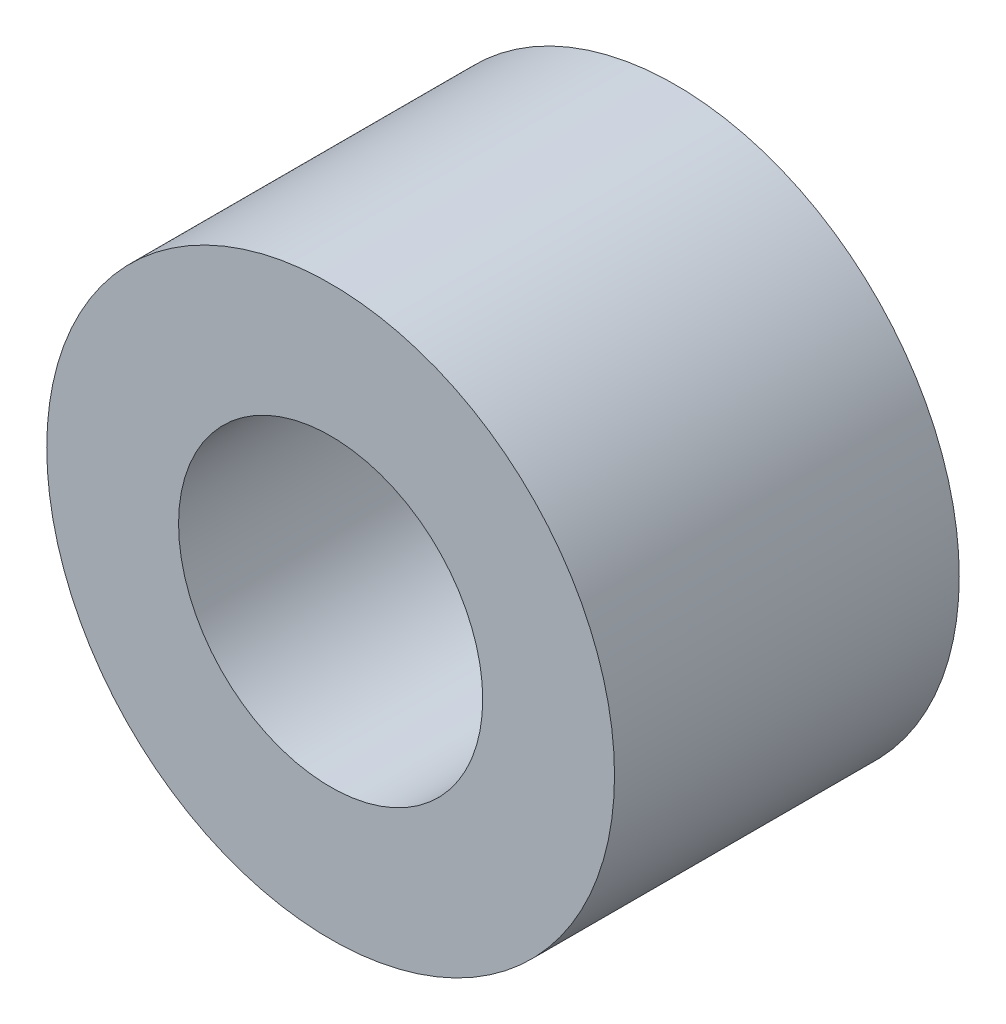
ISO-10303-21;
HEADER;
FILE_DESCRIPTION(('STEP AP214'),'2;1');
FILE_NAME('part.step','',(''),(''),'','','');
FILE_SCHEMA(('AUTOMOTIVE_DESIGN { 1 0 10303 214 1 1 1 1 }'));
ENDSEC;
DATA;
#1=APPLICATION_CONTEXT('core data for automotive mechanical design processes');
#2=APPLICATION_PROTOCOL_DEFINITION('international standard','automotive_design',2000,#1);
#3=PRODUCT_CONTEXT('',#1,'mechanical');
#4=PRODUCT('Part','Part','',(#3));
#5=PRODUCT_RELATED_PRODUCT_CATEGORY('part','',(#4));
#6=PRODUCT_DEFINITION_FORMATION('','',#4);
#7=PRODUCT_DEFINITION_CONTEXT('part definition',#1,'design');
#8=PRODUCT_DEFINITION('design','',#6,#7);
#9=PRODUCT_DEFINITION_SHAPE('','',#8);
#10=(LENGTH_UNIT() NAMED_UNIT(*) SI_UNIT(.MILLI.,.METRE.));
#11=(NAMED_UNIT(*) PLANE_ANGLE_UNIT() SI_UNIT($,.RADIAN.));
#12=(NAMED_UNIT(*) SI_UNIT($,.STERADIAN.) SOLID_ANGLE_UNIT());
#13=UNCERTAINTY_MEASURE_WITH_UNIT(LENGTH_MEASURE(1.E-05),#10,'distance_accuracy_value','');
#14=(GEOMETRIC_REPRESENTATION_CONTEXT(3) GLOBAL_UNCERTAINTY_ASSIGNED_CONTEXT((#13)) GLOBAL_UNIT_ASSIGNED_CONTEXT((#10,
#11,#12)) REPRESENTATION_CONTEXT('',''));
#15=CARTESIAN_POINT('',(0.,0.,0.));
#16=DIRECTION('',(0.,0.,1.));
#17=DIRECTION('',(1.,0.,0.));
#18=AXIS2_PLACEMENT_3D('',#15,#16,#17);
#19=CARTESIAN_POINT('',(0.,0.,-34.));
#20=DIRECTION('',(0.,0.,1.));
#21=DIRECTION('',(1.,0.,0.));
#22=AXIS2_PLACEMENT_3D('',#19,#20,#21);
#23=CYLINDRICAL_SURFACE('',#22,15.);
#24=CARTESIAN_POINT('',(0.,0.,-34.));
#25=DIRECTION('',(0.,0.,1.));
#26=DIRECTION('',(1.,0.,0.));
#27=AXIS2_PLACEMENT_3D('',#24,#25,#26);
#28=CIRCLE('',#27,15.);
#29=CARTESIAN_POINT('',(15.,0.,-34.));
#30=VERTEX_POINT('',#29);
#31=EDGE_CURVE('E43',#30,#30,#28,.T.);
#32=ORIENTED_EDGE('',*,*,#31,.F.);
#33=EDGE_LOOP('',(#32));
#34=FACE_BOUND('',#33,.T.);
#35=CARTESIAN_POINT('',(0.,0.,0.));
#36=DIRECTION('',(0.,0.,1.));
#37=DIRECTION('',(1.,0.,0.));
#38=AXIS2_PLACEMENT_3D('',#35,#36,#37);
#39=CIRCLE('',#38,15.);
#40=CARTESIAN_POINT('',(15.,0.,0.));
#41=VERTEX_POINT('',#40);
#42=EDGE_CURVE('E50',#41,#41,#39,.T.);
#43=ORIENTED_EDGE('',*,*,#42,.T.);
#44=EDGE_LOOP('',(#43));
#45=FACE_BOUND('',#44,.T.);
#46=ADVANCED_FACE('F36',(#34,#45),#23,.F.);
#47=CARTESIAN_POINT('',(0.,0.,-34.));
#48=DIRECTION('',(0.,0.,1.));
#49=DIRECTION('',(1.,0.,0.));
#50=AXIS2_PLACEMENT_3D('',#47,#48,#49);
#51=CYLINDRICAL_SURFACE('',#50,28.);
#52=CARTESIAN_POINT('',(0.,0.,-34.));
#53=DIRECTION('',(0.,0.,1.));
#54=DIRECTION('',(1.,0.,0.));
#55=AXIS2_PLACEMENT_3D('',#52,#53,#54);
#56=CIRCLE('',#55,28.);
#57=CARTESIAN_POINT('',(28.,0.,-34.));
#58=VERTEX_POINT('',#57);
#59=EDGE_CURVE('E10',#58,#58,#56,.T.);
#60=ORIENTED_EDGE('',*,*,#59,.T.);
#61=EDGE_LOOP('',(#60));
#62=FACE_BOUND('',#61,.T.);
#63=CARTESIAN_POINT('',(0.,0.,0.));
#64=DIRECTION('',(0.,0.,1.));
#65=DIRECTION('',(1.,0.,0.));
#66=AXIS2_PLACEMENT_3D('',#63,#64,#65);
#67=CIRCLE('',#66,28.);
#68=CARTESIAN_POINT('',(28.,0.,0.));
#69=VERTEX_POINT('',#68);
#70=EDGE_CURVE('E39',#69,#69,#67,.T.);
#71=ORIENTED_EDGE('',*,*,#70,.F.);
#72=EDGE_LOOP('',(#71));
#73=FACE_BOUND('',#72,.T.);
#74=ADVANCED_FACE('F94',(#62,#73),#51,.T.);
#75=CARTESIAN_POINT('',(0.,0.,-34.));
#76=DIRECTION('',(0.,0.,1.));
#77=DIRECTION('',(1.,0.,0.));
#78=AXIS2_PLACEMENT_3D('',#75,#76,#77);
#79=PLANE('',#78);
#80=CARTESIAN_POINT('',(-3.,-23.,-34.));
#81=DIRECTION('',(0.,0.,-1.));
#82=DIRECTION('',(1.,0.,0.));
#83=AXIS2_PLACEMENT_3D('',#80,#81,#82);
#84=CIRCLE('',#83,1.5);
#85=CARTESIAN_POINT('',(-1.5,-23.,-34.));
#86=VERTEX_POINT('',#85);
#87=EDGE_CURVE('E75',#86,#86,#84,.T.);
#88=ORIENTED_EDGE('',*,*,#87,.F.);
#89=EDGE_LOOP('',(#88));
#90=FACE_BOUND('',#89,.T.);
#91=CARTESIAN_POINT('',(3.,-23.,-34.));
#92=DIRECTION('',(0.,0.,-1.));
#93=DIRECTION('',(1.,0.,0.));
#94=AXIS2_PLACEMENT_3D('',#91,#92,#93);
#95=CIRCLE('',#94,1.5);
#96=CARTESIAN_POINT('',(4.5,-23.,-34.));
#97=VERTEX_POINT('',#96);
#98=EDGE_CURVE('E65',#97,#97,#95,.T.);
#99=ORIENTED_EDGE('',*,*,#98,.F.);
#100=EDGE_LOOP('',(#99));
#101=FACE_BOUND('',#100,.T.);
#102=CARTESIAN_POINT('',(3.,23.,-34.));
#103=DIRECTION('',(0.,0.,-1.));
#104=DIRECTION('',(-1.,0.,0.));
#105=AXIS2_PLACEMENT_3D('',#102,#103,#104);
#106=CIRCLE('',#105,1.5);
#107=CARTESIAN_POINT('',(1.5,23.,-34.));
#108=VERTEX_POINT('',#107);
#109=EDGE_CURVE('E57',#108,#108,#106,.T.);
#110=ORIENTED_EDGE('',*,*,#109,.F.);
#111=EDGE_LOOP('',(#110));
#112=FACE_BOUND('',#111,.T.);
#113=CARTESIAN_POINT('',(-3.,23.,-34.));
#114=DIRECTION('',(0.,0.,-1.));
#115=DIRECTION('',(-1.,0.,0.));
#116=AXIS2_PLACEMENT_3D('',#113,#114,#115);
#117=CIRCLE('',#116,1.5);
#118=CARTESIAN_POINT('',(-4.5,23.,-34.));
#119=VERTEX_POINT('',#118);
#120=EDGE_CURVE('E62',#119,#119,#117,.T.);
#121=ORIENTED_EDGE('',*,*,#120,.F.);
#122=EDGE_LOOP('',(#121));
#123=FACE_BOUND('',#122,.T.);
#124=ORIENTED_EDGE('',*,*,#31,.T.);
#125=EDGE_LOOP('',(#124));
#126=FACE_BOUND('',#125,.T.);
#127=ORIENTED_EDGE('',*,*,#59,.F.);
#128=EDGE_LOOP('',(#127));
#129=FACE_BOUND('',#128,.T.);
#130=ADVANCED_FACE('F90',(#90,#101,#112,#123,#126,#129),#79,.F.);
#131=CARTESIAN_POINT('',(0.,0.,0.));
#132=DIRECTION('',(0.,0.,1.));
#133=DIRECTION('',(1.,0.,0.));
#134=AXIS2_PLACEMENT_3D('',#131,#132,#133);
#135=PLANE('',#134);
#136=ORIENTED_EDGE('',*,*,#42,.F.);
#137=EDGE_LOOP('',(#136));
#138=FACE_BOUND('',#137,.T.);
#139=ORIENTED_EDGE('',*,*,#70,.T.);
#140=EDGE_LOOP('',(#139));
#141=FACE_BOUND('',#140,.T.);
#142=ADVANCED_FACE('F93',(#138,#141),#135,.T.);
#143=CARTESIAN_POINT('',(-3.,23.,-30.));
#144=DIRECTION('',(0.,0.,-1.));
#145=DIRECTION('',(-1.,0.,0.));
#146=AXIS2_PLACEMENT_3D('',#143,#144,#145);
#147=CYLINDRICAL_SURFACE('',#146,1.5);
#148=CARTESIAN_POINT('',(-3.,23.,-30.));
#149=DIRECTION('',(0.,0.,-1.));
#150=DIRECTION('',(-1.,0.,0.));
#151=AXIS2_PLACEMENT_3D('',#148,#149,#150);
#152=CIRCLE('',#151,1.5);
#153=CARTESIAN_POINT('',(-4.5,23.,-30.));
#154=VERTEX_POINT('',#153);
#155=EDGE_CURVE('E69',#154,#154,#152,.T.);
#156=ORIENTED_EDGE('',*,*,#155,.F.);
#157=EDGE_LOOP('',(#156));
#158=FACE_BOUND('',#157,.T.);
#159=ORIENTED_EDGE('',*,*,#120,.T.);
#160=EDGE_LOOP('',(#159));
#161=FACE_BOUND('',#160,.T.);
#162=ADVANCED_FACE('F113',(#158,#161),#147,.F.);
#163=CARTESIAN_POINT('',(-3.,23.,-30.));
#164=DIRECTION('',(0.,0.,-1.));
#165=DIRECTION('',(-1.,0.,0.));
#166=AXIS2_PLACEMENT_3D('',#163,#164,#165);
#167=PLANE('',#166);
#168=ORIENTED_EDGE('',*,*,#155,.T.);
#169=EDGE_LOOP('',(#168));
#170=FACE_BOUND('',#169,.T.);
#171=ADVANCED_FACE('F116',(#170),#167,.T.);
#172=CARTESIAN_POINT('',(3.,23.,-30.));
#173=DIRECTION('',(0.,0.,-1.));
#174=DIRECTION('',(-1.,0.,0.));
#175=AXIS2_PLACEMENT_3D('',#172,#173,#174);
#176=CYLINDRICAL_SURFACE('',#175,1.5);
#177=CARTESIAN_POINT('',(3.,23.,-30.));
#178=DIRECTION('',(0.,0.,-1.));
#179=DIRECTION('',(-1.,0.,0.));
#180=AXIS2_PLACEMENT_3D('',#177,#178,#179);
#181=CIRCLE('',#180,1.5);
#182=CARTESIAN_POINT('',(1.5,23.,-30.));
#183=VERTEX_POINT('',#182);
#184=EDGE_CURVE('E52',#183,#183,#181,.T.);
#185=ORIENTED_EDGE('',*,*,#184,.F.);
#186=EDGE_LOOP('',(#185));
#187=FACE_BOUND('',#186,.T.);
#188=ORIENTED_EDGE('',*,*,#109,.T.);
#189=EDGE_LOOP('',(#188));
#190=FACE_BOUND('',#189,.T.);
#191=ADVANCED_FACE('F119',(#187,#190),#176,.F.);
#192=CARTESIAN_POINT('',(3.,23.,-30.));
#193=DIRECTION('',(0.,0.,-1.));
#194=DIRECTION('',(-1.,0.,0.));
#195=AXIS2_PLACEMENT_3D('',#192,#193,#194);
#196=PLANE('',#195);
#197=ORIENTED_EDGE('',*,*,#184,.T.);
#198=EDGE_LOOP('',(#197));
#199=FACE_BOUND('',#198,.T.);
#200=ADVANCED_FACE('F125',(#199),#196,.T.);
#201=CARTESIAN_POINT('',(3.,-23.,-30.));
#202=DIRECTION('',(0.,0.,-1.));
#203=DIRECTION('',(-1.,0.,0.));
#204=AXIS2_PLACEMENT_3D('',#201,#202,#203);
#205=CYLINDRICAL_SURFACE('',#204,1.5);
#206=CARTESIAN_POINT('',(3.,-23.,-30.));
#207=DIRECTION('',(0.,0.,-1.));
#208=DIRECTION('',(1.,0.,0.));
#209=AXIS2_PLACEMENT_3D('',#206,#207,#208);
#210=CIRCLE('',#209,1.5);
#211=CARTESIAN_POINT('',(4.5,-23.,-30.));
#212=VERTEX_POINT('',#211);
#213=EDGE_CURVE('E80',#212,#212,#210,.T.);
#214=ORIENTED_EDGE('',*,*,#213,.F.);
#215=EDGE_LOOP('',(#214));
#216=FACE_BOUND('',#215,.T.);
#217=ORIENTED_EDGE('',*,*,#98,.T.);
#218=EDGE_LOOP('',(#217));
#219=FACE_BOUND('',#218,.T.);
#220=ADVANCED_FACE('F88',(#216,#219),#205,.F.);
#221=CARTESIAN_POINT('',(3.,-23.,-30.));
#222=DIRECTION('',(0.,0.,-1.));
#223=DIRECTION('',(1.,0.,0.));
#224=AXIS2_PLACEMENT_3D('',#221,#222,#223);
#225=PLANE('',#224);
#226=ORIENTED_EDGE('',*,*,#213,.T.);
#227=EDGE_LOOP('',(#226));
#228=FACE_BOUND('',#227,.T.);
#229=ADVANCED_FACE('F131',(#228),#225,.T.);
#230=CARTESIAN_POINT('',(-3.,-23.,-30.));
#231=DIRECTION('',(0.,0.,-1.));
#232=DIRECTION('',(-1.,0.,0.));
#233=AXIS2_PLACEMENT_3D('',#230,#231,#232);
#234=CYLINDRICAL_SURFACE('',#233,1.5);
#235=CARTESIAN_POINT('',(-3.,-23.,-30.));
#236=DIRECTION('',(0.,0.,-1.));
#237=DIRECTION('',(1.,0.,0.));
#238=AXIS2_PLACEMENT_3D('',#235,#236,#237);
#239=CIRCLE('',#238,1.5);
#240=CARTESIAN_POINT('',(-1.5,-23.,-30.));
#241=VERTEX_POINT('',#240);
#242=EDGE_CURVE('E71',#241,#241,#239,.T.);
#243=ORIENTED_EDGE('',*,*,#242,.F.);
#244=EDGE_LOOP('',(#243));
#245=FACE_BOUND('',#244,.T.);
#246=ORIENTED_EDGE('',*,*,#87,.T.);
#247=EDGE_LOOP('',(#246));
#248=FACE_BOUND('',#247,.T.);
#249=ADVANCED_FACE('F135',(#245,#248),#234,.F.);
#250=CARTESIAN_POINT('',(-3.,-23.,-30.));
#251=DIRECTION('',(0.,0.,-1.));
#252=DIRECTION('',(1.,0.,0.));
#253=AXIS2_PLACEMENT_3D('',#250,#251,#252);
#254=PLANE('',#253);
#255=ORIENTED_EDGE('',*,*,#242,.T.);
#256=EDGE_LOOP('',(#255));
#257=FACE_BOUND('',#256,.T.);
#258=ADVANCED_FACE('F138',(#257),#254,.T.);
#259=CLOSED_SHELL('',(#46,#74,#130,#142,#162,#171,#191,#200,#220,#229,#249,#258));
#260=MANIFOLD_SOLID_BREP('B2',#259);
#261=ADVANCED_BREP_SHAPE_REPRESENTATION('',(#18,#260),#14);
#262=SHAPE_DEFINITION_REPRESENTATION(#9,#261);
ENDSEC;
END-ISO-10303-21;
